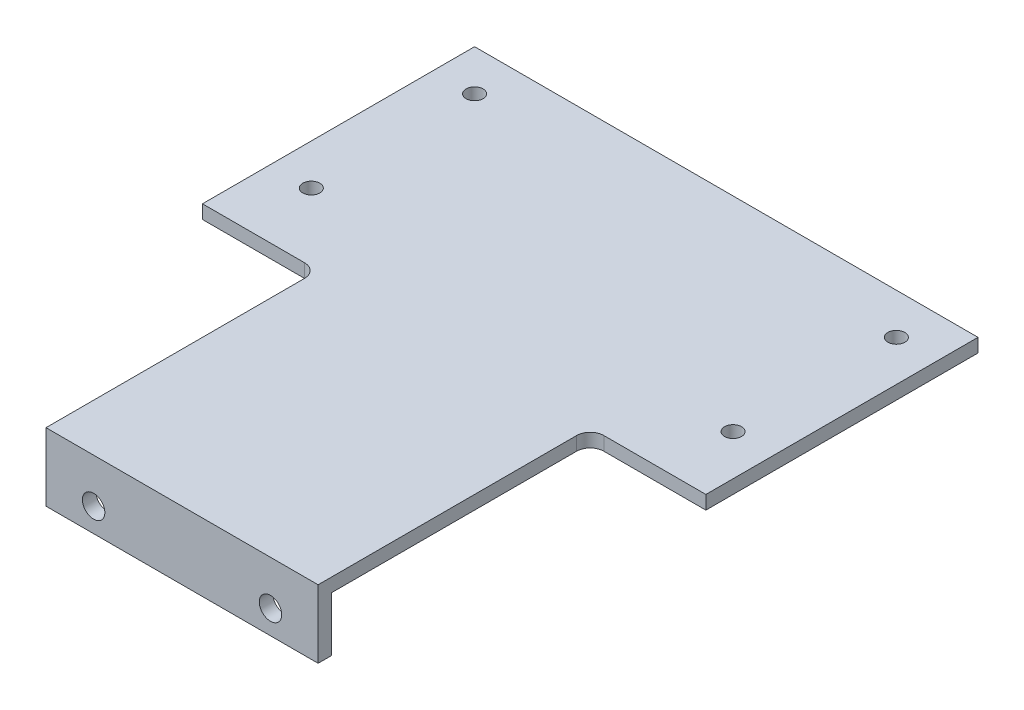
ISO-10303-21;
HEADER;
FILE_DESCRIPTION(('STEP AP214'),'2;1');
FILE_NAME('part.step','',(''),(''),'','','');
FILE_SCHEMA(('AUTOMOTIVE_DESIGN { 1 0 10303 214 1 1 1 1 }'));
ENDSEC;
DATA;
#1=APPLICATION_CONTEXT('core data for automotive mechanical design processes');
#2=APPLICATION_PROTOCOL_DEFINITION('international standard','automotive_design',2000,#1);
#3=PRODUCT_CONTEXT('',#1,'mechanical');
#4=PRODUCT('Part','Part','',(#3));
#5=PRODUCT_RELATED_PRODUCT_CATEGORY('part','',(#4));
#6=PRODUCT_DEFINITION_FORMATION('','',#4);
#7=PRODUCT_DEFINITION_CONTEXT('part definition',#1,'design');
#8=PRODUCT_DEFINITION('design','',#6,#7);
#9=PRODUCT_DEFINITION_SHAPE('','',#8);
#10=(LENGTH_UNIT() NAMED_UNIT(*) SI_UNIT(.MILLI.,.METRE.));
#11=(NAMED_UNIT(*) PLANE_ANGLE_UNIT() SI_UNIT($,.RADIAN.));
#12=(NAMED_UNIT(*) SI_UNIT($,.STERADIAN.) SOLID_ANGLE_UNIT());
#13=UNCERTAINTY_MEASURE_WITH_UNIT(LENGTH_MEASURE(1.E-05),#10,'distance_accuracy_value','');
#14=(GEOMETRIC_REPRESENTATION_CONTEXT(3) GLOBAL_UNCERTAINTY_ASSIGNED_CONTEXT((#13)) GLOBAL_UNIT_ASSIGNED_CONTEXT((#10,
#11,#12)) REPRESENTATION_CONTEXT('',''));
#15=CARTESIAN_POINT('',(0.,0.,0.));
#16=DIRECTION('',(0.,0.,1.));
#17=DIRECTION('',(1.,0.,0.));
#18=AXIS2_PLACEMENT_3D('',#15,#16,#17);
#19=CARTESIAN_POINT('',(0.,0.,0.));
#20=DIRECTION('',(0.,1.,0.));
#21=DIRECTION('',(0.,0.,1.));
#22=AXIS2_PLACEMENT_3D('',#19,#20,#21);
#23=PLANE('',#22);
#24=CARTESIAN_POINT('',(51.,0.,-74.));
#25=DIRECTION('',(0.,1.,0.));
#26=DIRECTION('',(0.,0.,1.));
#27=AXIS2_PLACEMENT_3D('',#24,#25,#26);
#28=CIRCLE('',#27,1.25);
#29=CARTESIAN_POINT('',(51.,0.,-72.75));
#30=VERTEX_POINT('',#29);
#31=EDGE_CURVE('E270',#30,#30,#28,.T.);
#32=ORIENTED_EDGE('',*,*,#31,.T.);
#33=EDGE_LOOP('',(#32));
#34=FACE_BOUND('',#33,.T.);
#35=CARTESIAN_POINT('',(51.,0.,-50.));
#36=DIRECTION('',(0.,1.,0.));
#37=DIRECTION('',(0.,0.,1.));
#38=AXIS2_PLACEMENT_3D('',#35,#36,#37);
#39=CIRCLE('',#38,1.25);
#40=CARTESIAN_POINT('',(51.,0.,-48.75));
#41=VERTEX_POINT('',#40);
#42=EDGE_CURVE('E280',#41,#41,#39,.T.);
#43=ORIENTED_EDGE('',*,*,#42,.T.);
#44=EDGE_LOOP('',(#43));
#45=FACE_BOUND('',#44,.T.);
#46=CARTESIAN_POINT('',(-11.,0.,-50.));
#47=DIRECTION('',(0.,1.,0.));
#48=DIRECTION('',(0.,0.,1.));
#49=AXIS2_PLACEMENT_3D('',#46,#47,#48);
#50=CIRCLE('',#49,1.25);
#51=CARTESIAN_POINT('',(-11.,0.,-48.75));
#52=VERTEX_POINT('',#51);
#53=EDGE_CURVE('E284',#52,#52,#50,.T.);
#54=ORIENTED_EDGE('',*,*,#53,.T.);
#55=EDGE_LOOP('',(#54));
#56=FACE_BOUND('',#55,.T.);
#57=CARTESIAN_POINT('',(-11.,0.,-74.));
#58=DIRECTION('',(0.,1.,0.));
#59=DIRECTION('',(0.,0.,1.));
#60=AXIS2_PLACEMENT_3D('',#57,#58,#59);
#61=CIRCLE('',#60,1.25);
#62=CARTESIAN_POINT('',(-11.,0.,-72.75));
#63=VERTEX_POINT('',#62);
#64=EDGE_CURVE('E288',#63,#63,#61,.T.);
#65=ORIENTED_EDGE('',*,*,#64,.T.);
#66=EDGE_LOOP('',(#65));
#67=FACE_BOUND('',#66,.T.);
#68=DIRECTION('',(1.,0.,0.));
#69=VECTOR('',#68,1.);
#70=CARTESIAN_POINT('',(0.,0.,-2.));
#71=LINE('',#70,#69);
#72=CARTESIAN_POINT('',(0.,0.,-1.99999999999999));
#73=VERTEX_POINT('',#72);
#74=CARTESIAN_POINT('',(40.,0.,-2.));
#75=VERTEX_POINT('',#74);
#76=EDGE_CURVE('E150',#73,#75,#71,.T.);
#77=ORIENTED_EDGE('',*,*,#76,.F.);
#78=DIRECTION('',(0.,0.,1.));
#79=VECTOR('',#78,1.);
#80=CARTESIAN_POINT('',(0.,0.,-40.));
#81=LINE('',#80,#79);
#82=CARTESIAN_POINT('',(0.,0.,-38.));
#83=VERTEX_POINT('',#82);
#84=EDGE_CURVE('E156',#83,#73,#81,.T.);
#85=ORIENTED_EDGE('',*,*,#84,.F.);
#86=CARTESIAN_POINT('',(-2.,0.,-38.));
#87=DIRECTION('',(0.,1.,0.));
#88=DIRECTION('',(0.,0.,1.));
#89=AXIS2_PLACEMENT_3D('',#86,#87,#88);
#90=CIRCLE('',#89,2.);
#91=CARTESIAN_POINT('',(-2.,0.,-40.));
#92=VERTEX_POINT('',#91);
#93=EDGE_CURVE('E217',#83,#92,#90,.T.);
#94=ORIENTED_EDGE('',*,*,#93,.T.);
#95=DIRECTION('',(1.,0.,0.));
#96=VECTOR('',#95,1.);
#97=CARTESIAN_POINT('',(-17.,0.,-40.));
#98=LINE('',#97,#96);
#99=CARTESIAN_POINT('',(-17.,0.,-40.));
#100=VERTEX_POINT('',#99);
#101=EDGE_CURVE('E167',#100,#92,#98,.T.);
#102=ORIENTED_EDGE('',*,*,#101,.F.);
#103=DIRECTION('',(0.,0.,1.));
#104=VECTOR('',#103,1.);
#105=CARTESIAN_POINT('',(-17.,0.,-80.));
#106=LINE('',#105,#104);
#107=CARTESIAN_POINT('',(-17.,0.,-80.));
#108=VERTEX_POINT('',#107);
#109=EDGE_CURVE('E190',#108,#100,#106,.T.);
#110=ORIENTED_EDGE('',*,*,#109,.F.);
#111=DIRECTION('',(-1.,0.,0.));
#112=VECTOR('',#111,1.);
#113=CARTESIAN_POINT('',(-17.,0.,-80.));
#114=LINE('',#113,#112);
#115=CARTESIAN_POINT('',(57.,0.,-80.));
#116=VERTEX_POINT('',#115);
#117=EDGE_CURVE('E188',#116,#108,#114,.T.);
#118=ORIENTED_EDGE('',*,*,#117,.F.);
#119=DIRECTION('',(0.,0.,-1.));
#120=VECTOR('',#119,1.);
#121=CARTESIAN_POINT('',(57.,0.,-80.));
#122=LINE('',#121,#120);
#123=CARTESIAN_POINT('',(57.,0.,-40.));
#124=VERTEX_POINT('',#123);
#125=EDGE_CURVE('E186',#124,#116,#122,.T.);
#126=ORIENTED_EDGE('',*,*,#125,.F.);
#127=DIRECTION('',(1.,0.,0.));
#128=VECTOR('',#127,1.);
#129=CARTESIAN_POINT('',(57.,0.,-40.));
#130=LINE('',#129,#128);
#131=CARTESIAN_POINT('',(42.,0.,-40.));
#132=VERTEX_POINT('',#131);
#133=EDGE_CURVE('E184',#132,#124,#130,.T.);
#134=ORIENTED_EDGE('',*,*,#133,.F.);
#135=CARTESIAN_POINT('',(42.,0.,-38.));
#136=DIRECTION('',(0.,1.,0.));
#137=DIRECTION('',(0.,0.,1.));
#138=AXIS2_PLACEMENT_3D('',#135,#136,#137);
#139=CIRCLE('',#138,2.);
#140=CARTESIAN_POINT('',(40.,0.,-38.));
#141=VERTEX_POINT('',#140);
#142=EDGE_CURVE('E49',#132,#141,#139,.T.);
#143=ORIENTED_EDGE('',*,*,#142,.T.);
#144=DIRECTION('',(0.,0.,-1.));
#145=VECTOR('',#144,1.);
#146=CARTESIAN_POINT('',(40.,0.,-40.));
#147=LINE('',#146,#145);
#148=EDGE_CURVE('E159',#75,#141,#147,.T.);
#149=ORIENTED_EDGE('',*,*,#148,.F.);
#150=EDGE_LOOP('',(#77,#85,#94,#102,#110,#118,#126,#134,#143,#149));
#151=FACE_BOUND('',#150,.T.);
#152=ADVANCED_FACE('F41',(#34,#45,#56,#67,#151),#23,.F.);
#153=CARTESIAN_POINT('',(0.,2.,-40.));
#154=DIRECTION('',(1.,0.,0.));
#155=DIRECTION('',(0.,0.,-1.));
#156=AXIS2_PLACEMENT_3D('',#153,#154,#155);
#157=PLANE('',#156);
#158=DIRECTION('',(0.,0.,1.));
#159=VECTOR('',#158,1.);
#160=CARTESIAN_POINT('',(0.,2.,-40.));
#161=LINE('',#160,#159);
#162=CARTESIAN_POINT('',(0.,2.,-38.));
#163=VERTEX_POINT('',#162);
#164=CARTESIAN_POINT('',(0.,2.,0.));
#165=VERTEX_POINT('',#164);
#166=EDGE_CURVE('E164',#163,#165,#161,.T.);
#167=ORIENTED_EDGE('',*,*,#166,.F.);
#168=DIRECTION('',(0.,-1.,0.));
#169=VECTOR('',#168,1.);
#170=CARTESIAN_POINT('',(0.,0.,-38.));
#171=LINE('',#170,#169);
#172=EDGE_CURVE('E209',#163,#83,#171,.T.);
#173=ORIENTED_EDGE('',*,*,#172,.T.);
#174=ORIENTED_EDGE('',*,*,#84,.T.);
#175=DIRECTION('',(0.,1.,0.));
#176=VECTOR('',#175,1.);
#177=CARTESIAN_POINT('',(0.,-8.,-2.));
#178=LINE('',#177,#176);
#179=CARTESIAN_POINT('',(0.,-8.,-2.));
#180=VERTEX_POINT('',#179);
#181=EDGE_CURVE('E134',#180,#73,#178,.T.);
#182=ORIENTED_EDGE('',*,*,#181,.F.);
#183=DIRECTION('',(0.,0.,-1.));
#184=VECTOR('',#183,1.);
#185=CARTESIAN_POINT('',(0.,-8.,0.));
#186=LINE('',#185,#184);
#187=CARTESIAN_POINT('',(0.,-8.,0.));
#188=VERTEX_POINT('',#187);
#189=EDGE_CURVE('E141',#188,#180,#186,.T.);
#190=ORIENTED_EDGE('',*,*,#189,.F.);
#191=DIRECTION('',(0.,-1.,0.));
#192=VECTOR('',#191,1.);
#193=CARTESIAN_POINT('',(0.,2.,0.));
#194=LINE('',#193,#192);
#195=EDGE_CURVE('E207',#165,#188,#194,.T.);
#196=ORIENTED_EDGE('',*,*,#195,.F.);
#197=EDGE_LOOP('',(#167,#173,#174,#182,#190,#196));
#198=FACE_BOUND('',#197,.T.);
#199=ADVANCED_FACE('F153',(#198),#157,.F.);
#200=CARTESIAN_POINT('',(0.,2.,0.));
#201=DIRECTION('',(0.,0.,-1.));
#202=DIRECTION('',(-1.,0.,0.));
#203=AXIS2_PLACEMENT_3D('',#200,#201,#202);
#204=PLANE('',#203);
#205=CARTESIAN_POINT('',(33.,-4.4999999999999,0.));
#206=DIRECTION('',(0.,0.,-1.));
#207=DIRECTION('',(-1.,0.,0.));
#208=AXIS2_PLACEMENT_3D('',#205,#206,#207);
#209=CIRCLE('',#208,1.64999999999986);
#210=CARTESIAN_POINT('',(31.3500000000001,-4.4999999999999,0.));
#211=VERTEX_POINT('',#210);
#212=EDGE_CURVE('E260',#211,#211,#209,.T.);
#213=ORIENTED_EDGE('',*,*,#212,.T.);
#214=EDGE_LOOP('',(#213));
#215=FACE_BOUND('',#214,.T.);
#216=CARTESIAN_POINT('',(6.99999999999996,-4.4999999999999,0.));
#217=DIRECTION('',(0.,0.,-1.));
#218=DIRECTION('',(-1.,0.,0.));
#219=AXIS2_PLACEMENT_3D('',#216,#217,#218);
#220=CIRCLE('',#219,1.64999999999987);
#221=CARTESIAN_POINT('',(5.35000000000008,-4.4999999999999,0.));
#222=VERTEX_POINT('',#221);
#223=EDGE_CURVE('E275',#222,#222,#220,.T.);
#224=ORIENTED_EDGE('',*,*,#223,.T.);
#225=EDGE_LOOP('',(#224));
#226=FACE_BOUND('',#225,.T.);
#227=ORIENTED_EDGE('',*,*,#195,.T.);
#228=DIRECTION('',(-1.,0.,0.));
#229=VECTOR('',#228,1.);
#230=CARTESIAN_POINT('',(0.,-8.,0.));
#231=LINE('',#230,#229);
#232=CARTESIAN_POINT('',(40.,-8.,0.));
#233=VERTEX_POINT('',#232);
#234=EDGE_CURVE('E147',#233,#188,#231,.T.);
#235=ORIENTED_EDGE('',*,*,#234,.F.);
#236=DIRECTION('',(0.,-1.,0.));
#237=VECTOR('',#236,1.);
#238=CARTESIAN_POINT('',(40.,2.,0.));
#239=LINE('',#238,#237);
#240=CARTESIAN_POINT('',(40.,2.,0.));
#241=VERTEX_POINT('',#240);
#242=EDGE_CURVE('E205',#241,#233,#239,.T.);
#243=ORIENTED_EDGE('',*,*,#242,.F.);
#244=DIRECTION('',(1.,0.,0.));
#245=VECTOR('',#244,1.);
#246=CARTESIAN_POINT('',(0.,2.,0.));
#247=LINE('',#246,#245);
#248=EDGE_CURVE('E166',#165,#241,#247,.T.);
#249=ORIENTED_EDGE('',*,*,#248,.F.);
#250=EDGE_LOOP('',(#227,#235,#243,#249));
#251=FACE_BOUND('',#250,.T.);
#252=ADVANCED_FACE('F258',(#215,#226,#251),#204,.F.);
#253=CARTESIAN_POINT('',(40.,2.,-40.));
#254=DIRECTION('',(-1.,0.,0.));
#255=DIRECTION('',(0.,0.,1.));
#256=AXIS2_PLACEMENT_3D('',#253,#254,#255);
#257=PLANE('',#256);
#258=ORIENTED_EDGE('',*,*,#148,.T.);
#259=DIRECTION('',(0.,-1.,0.));
#260=VECTOR('',#259,1.);
#261=CARTESIAN_POINT('',(40.,2.,-38.));
#262=LINE('',#261,#260);
#263=CARTESIAN_POINT('',(40.,2.,-38.));
#264=VERTEX_POINT('',#263);
#265=EDGE_CURVE('E56',#141,#264,#262,.F.);
#266=ORIENTED_EDGE('',*,*,#265,.T.);
#267=DIRECTION('',(0.,0.,-1.));
#268=VECTOR('',#267,1.);
#269=CARTESIAN_POINT('',(40.,2.,-40.));
#270=LINE('',#269,#268);
#271=EDGE_CURVE('E169',#241,#264,#270,.T.);
#272=ORIENTED_EDGE('',*,*,#271,.F.);
#273=ORIENTED_EDGE('',*,*,#242,.T.);
#274=DIRECTION('',(0.,0.,1.));
#275=VECTOR('',#274,1.);
#276=CARTESIAN_POINT('',(40.,-8.,0.));
#277=LINE('',#276,#275);
#278=CARTESIAN_POINT('',(40.,-8.,-2.));
#279=VERTEX_POINT('',#278);
#280=EDGE_CURVE('E140',#279,#233,#277,.T.);
#281=ORIENTED_EDGE('',*,*,#280,.F.);
#282=DIRECTION('',(0.,1.,0.));
#283=VECTOR('',#282,1.);
#284=CARTESIAN_POINT('',(40.,-8.,-2.));
#285=LINE('',#284,#283);
#286=EDGE_CURVE('E136',#279,#75,#285,.T.);
#287=ORIENTED_EDGE('',*,*,#286,.T.);
#288=EDGE_LOOP('',(#258,#266,#272,#273,#281,#287));
#289=FACE_BOUND('',#288,.T.);
#290=ADVANCED_FACE('F255',(#289),#257,.F.);
#291=CARTESIAN_POINT('',(57.,2.,-40.));
#292=DIRECTION('',(0.,0.,-1.));
#293=DIRECTION('',(-1.,0.,0.));
#294=AXIS2_PLACEMENT_3D('',#291,#292,#293);
#295=PLANE('',#294);
#296=DIRECTION('',(1.,0.,0.));
#297=VECTOR('',#296,1.);
#298=CARTESIAN_POINT('',(57.,2.,-40.));
#299=LINE('',#298,#297);
#300=CARTESIAN_POINT('',(42.,2.,-40.));
#301=VERTEX_POINT('',#300);
#302=CARTESIAN_POINT('',(57.,2.,-40.));
#303=VERTEX_POINT('',#302);
#304=EDGE_CURVE('E171',#301,#303,#299,.T.);
#305=ORIENTED_EDGE('',*,*,#304,.F.);
#306=DIRECTION('',(0.,-1.,0.));
#307=VECTOR('',#306,1.);
#308=CARTESIAN_POINT('',(42.,0.,-40.));
#309=LINE('',#308,#307);
#310=EDGE_CURVE('E213',#301,#132,#309,.T.);
#311=ORIENTED_EDGE('',*,*,#310,.T.);
#312=ORIENTED_EDGE('',*,*,#133,.T.);
#313=DIRECTION('',(0.,-1.,0.));
#314=VECTOR('',#313,1.);
#315=CARTESIAN_POINT('',(57.,2.,-40.));
#316=LINE('',#315,#314);
#317=EDGE_CURVE('E202',#303,#124,#316,.T.);
#318=ORIENTED_EDGE('',*,*,#317,.F.);
#319=EDGE_LOOP('',(#305,#311,#312,#318));
#320=FACE_BOUND('',#319,.T.);
#321=ADVANCED_FACE('F250',(#320),#295,.F.);
#322=CARTESIAN_POINT('',(57.,2.,-80.));
#323=DIRECTION('',(-1.,0.,0.));
#324=DIRECTION('',(0.,0.,1.));
#325=AXIS2_PLACEMENT_3D('',#322,#323,#324);
#326=PLANE('',#325);
#327=ORIENTED_EDGE('',*,*,#125,.T.);
#328=DIRECTION('',(0.,-1.,0.));
#329=VECTOR('',#328,1.);
#330=CARTESIAN_POINT('',(57.,2.,-80.));
#331=LINE('',#330,#329);
#332=CARTESIAN_POINT('',(57.,2.,-80.));
#333=VERTEX_POINT('',#332);
#334=EDGE_CURVE('E199',#333,#116,#331,.T.);
#335=ORIENTED_EDGE('',*,*,#334,.F.);
#336=DIRECTION('',(0.,0.,-1.));
#337=VECTOR('',#336,1.);
#338=CARTESIAN_POINT('',(57.,2.,-80.));
#339=LINE('',#338,#337);
#340=EDGE_CURVE('E173',#303,#333,#339,.T.);
#341=ORIENTED_EDGE('',*,*,#340,.F.);
#342=ORIENTED_EDGE('',*,*,#317,.T.);
#343=EDGE_LOOP('',(#327,#335,#341,#342));
#344=FACE_BOUND('',#343,.T.);
#345=ADVANCED_FACE('F246',(#344),#326,.F.);
#346=CARTESIAN_POINT('',(-17.,2.,-80.));
#347=DIRECTION('',(0.,0.,1.));
#348=DIRECTION('',(1.,0.,0.));
#349=AXIS2_PLACEMENT_3D('',#346,#347,#348);
#350=PLANE('',#349);
#351=ORIENTED_EDGE('',*,*,#117,.T.);
#352=DIRECTION('',(0.,-1.,0.));
#353=VECTOR('',#352,1.);
#354=CARTESIAN_POINT('',(-17.,2.,-80.));
#355=LINE('',#354,#353);
#356=CARTESIAN_POINT('',(-17.,2.,-80.));
#357=VERTEX_POINT('',#356);
#358=EDGE_CURVE('E196',#357,#108,#355,.T.);
#359=ORIENTED_EDGE('',*,*,#358,.F.);
#360=DIRECTION('',(-1.,0.,0.));
#361=VECTOR('',#360,1.);
#362=CARTESIAN_POINT('',(-17.,2.,-80.));
#363=LINE('',#362,#361);
#364=EDGE_CURVE('E175',#333,#357,#363,.T.);
#365=ORIENTED_EDGE('',*,*,#364,.F.);
#366=ORIENTED_EDGE('',*,*,#334,.T.);
#367=EDGE_LOOP('',(#351,#359,#365,#366));
#368=FACE_BOUND('',#367,.T.);
#369=ADVANCED_FACE('F241',(#368),#350,.F.);
#370=CARTESIAN_POINT('',(-17.,2.,-80.));
#371=DIRECTION('',(1.,0.,0.));
#372=DIRECTION('',(0.,0.,-1.));
#373=AXIS2_PLACEMENT_3D('',#370,#371,#372);
#374=PLANE('',#373);
#375=ORIENTED_EDGE('',*,*,#109,.T.);
#376=DIRECTION('',(0.,-1.,0.));
#377=VECTOR('',#376,1.);
#378=CARTESIAN_POINT('',(-17.,2.,-40.));
#379=LINE('',#378,#377);
#380=CARTESIAN_POINT('',(-17.,2.,-40.));
#381=VERTEX_POINT('',#380);
#382=EDGE_CURVE('E181',#381,#100,#379,.T.);
#383=ORIENTED_EDGE('',*,*,#382,.F.);
#384=DIRECTION('',(0.,0.,1.));
#385=VECTOR('',#384,1.);
#386=CARTESIAN_POINT('',(-17.,2.,-80.));
#387=LINE('',#386,#385);
#388=EDGE_CURVE('E177',#357,#381,#387,.T.);
#389=ORIENTED_EDGE('',*,*,#388,.F.);
#390=ORIENTED_EDGE('',*,*,#358,.T.);
#391=EDGE_LOOP('',(#375,#383,#389,#390));
#392=FACE_BOUND('',#391,.T.);
#393=ADVANCED_FACE('F236',(#392),#374,.F.);
#394=CARTESIAN_POINT('',(-17.,2.,-40.));
#395=DIRECTION('',(0.,0.,-1.));
#396=DIRECTION('',(-1.,0.,0.));
#397=AXIS2_PLACEMENT_3D('',#394,#395,#396);
#398=PLANE('',#397);
#399=ORIENTED_EDGE('',*,*,#101,.T.);
#400=DIRECTION('',(0.,-1.,0.));
#401=VECTOR('',#400,1.);
#402=CARTESIAN_POINT('',(-2.,2.,-40.));
#403=LINE('',#402,#401);
#404=CARTESIAN_POINT('',(-2.,2.,-40.));
#405=VERTEX_POINT('',#404);
#406=EDGE_CURVE('E211',#92,#405,#403,.F.);
#407=ORIENTED_EDGE('',*,*,#406,.T.);
#408=DIRECTION('',(1.,0.,0.));
#409=VECTOR('',#408,1.);
#410=CARTESIAN_POINT('',(-17.,2.,-40.));
#411=LINE('',#410,#409);
#412=EDGE_CURVE('E179',#381,#405,#411,.T.);
#413=ORIENTED_EDGE('',*,*,#412,.F.);
#414=ORIENTED_EDGE('',*,*,#382,.T.);
#415=EDGE_LOOP('',(#399,#407,#413,#414));
#416=FACE_BOUND('',#415,.T.);
#417=ADVANCED_FACE('F232',(#416),#398,.F.);
#418=CARTESIAN_POINT('',(0.,2.,0.));
#419=DIRECTION('',(0.,1.,0.));
#420=DIRECTION('',(0.,0.,1.));
#421=AXIS2_PLACEMENT_3D('',#418,#419,#420);
#422=PLANE('',#421);
#423=CARTESIAN_POINT('',(51.,2.,-74.));
#424=DIRECTION('',(0.,1.,0.));
#425=DIRECTION('',(0.,0.,-1.));
#426=AXIS2_PLACEMENT_3D('',#423,#424,#425);
#427=CIRCLE('',#426,1.25);
#428=CARTESIAN_POINT('',(51.,2.,-75.25));
#429=VERTEX_POINT('',#428);
#430=EDGE_CURVE('E297',#429,#429,#427,.T.);
#431=ORIENTED_EDGE('',*,*,#430,.F.);
#432=EDGE_LOOP('',(#431));
#433=FACE_BOUND('',#432,.T.);
#434=CARTESIAN_POINT('',(51.,2.,-50.));
#435=DIRECTION('',(0.,1.,0.));
#436=DIRECTION('',(0.,0.,-1.));
#437=AXIS2_PLACEMENT_3D('',#434,#435,#436);
#438=CIRCLE('',#437,1.25);
#439=CARTESIAN_POINT('',(51.,2.,-51.25));
#440=VERTEX_POINT('',#439);
#441=EDGE_CURVE('E300',#440,#440,#438,.T.);
#442=ORIENTED_EDGE('',*,*,#441,.F.);
#443=EDGE_LOOP('',(#442));
#444=FACE_BOUND('',#443,.T.);
#445=CARTESIAN_POINT('',(-11.,2.,-50.));
#446=DIRECTION('',(0.,1.,0.));
#447=DIRECTION('',(0.,0.,1.));
#448=AXIS2_PLACEMENT_3D('',#445,#446,#447);
#449=CIRCLE('',#448,1.25);
#450=CARTESIAN_POINT('',(-11.,2.,-48.75));
#451=VERTEX_POINT('',#450);
#452=EDGE_CURVE('E296',#451,#451,#449,.T.);
#453=ORIENTED_EDGE('',*,*,#452,.F.);
#454=EDGE_LOOP('',(#453));
#455=FACE_BOUND('',#454,.T.);
#456=CARTESIAN_POINT('',(-11.,2.,-74.));
#457=DIRECTION('',(0.,1.,0.));
#458=DIRECTION('',(0.,0.,1.));
#459=AXIS2_PLACEMENT_3D('',#456,#457,#458);
#460=CIRCLE('',#459,1.25);
#461=CARTESIAN_POINT('',(-11.,2.,-72.75));
#462=VERTEX_POINT('',#461);
#463=EDGE_CURVE('E293',#462,#462,#460,.T.);
#464=ORIENTED_EDGE('',*,*,#463,.F.);
#465=EDGE_LOOP('',(#464));
#466=FACE_BOUND('',#465,.T.);
#467=ORIENTED_EDGE('',*,*,#412,.T.);
#468=CARTESIAN_POINT('',(-2.,2.,-38.));
#469=DIRECTION('',(0.,1.,0.));
#470=DIRECTION('',(0.,0.,1.));
#471=AXIS2_PLACEMENT_3D('',#468,#469,#470);
#472=CIRCLE('',#471,2.);
#473=EDGE_CURVE('E219',#405,#163,#472,.F.);
#474=ORIENTED_EDGE('',*,*,#473,.T.);
#475=ORIENTED_EDGE('',*,*,#166,.T.);
#476=ORIENTED_EDGE('',*,*,#248,.T.);
#477=ORIENTED_EDGE('',*,*,#271,.T.);
#478=CARTESIAN_POINT('',(42.,2.,-38.));
#479=DIRECTION('',(0.,1.,0.));
#480=DIRECTION('',(0.,0.,1.));
#481=AXIS2_PLACEMENT_3D('',#478,#479,#480);
#482=CIRCLE('',#481,2.);
#483=EDGE_CURVE('E11',#264,#301,#482,.F.);
#484=ORIENTED_EDGE('',*,*,#483,.T.);
#485=ORIENTED_EDGE('',*,*,#304,.T.);
#486=ORIENTED_EDGE('',*,*,#340,.T.);
#487=ORIENTED_EDGE('',*,*,#364,.T.);
#488=ORIENTED_EDGE('',*,*,#388,.T.);
#489=EDGE_LOOP('',(#467,#474,#475,#476,#477,#484,#485,#486,#487,#488));
#490=FACE_BOUND('',#489,.T.);
#491=ADVANCED_FACE('F222',(#433,#444,#455,#466,#490),#422,.T.);
#492=CARTESIAN_POINT('',(0.,-8.,-2.));
#493=DIRECTION('',(0.,0.,1.));
#494=DIRECTION('',(1.,0.,0.));
#495=AXIS2_PLACEMENT_3D('',#492,#493,#494);
#496=PLANE('',#495);
#497=CARTESIAN_POINT('',(33.,-4.4999999999999,-2.));
#498=DIRECTION('',(0.,0.,-1.));
#499=DIRECTION('',(-1.,0.,0.));
#500=AXIS2_PLACEMENT_3D('',#497,#498,#499);
#501=CIRCLE('',#500,1.64999999999986);
#502=CARTESIAN_POINT('',(31.3500000000001,-4.4999999999999,-2.));
#503=VERTEX_POINT('',#502);
#504=EDGE_CURVE('E262',#503,#503,#501,.T.);
#505=ORIENTED_EDGE('',*,*,#504,.F.);
#506=EDGE_LOOP('',(#505));
#507=FACE_BOUND('',#506,.T.);
#508=CARTESIAN_POINT('',(6.99999999999996,-4.4999999999999,-2.));
#509=DIRECTION('',(0.,0.,-1.));
#510=DIRECTION('',(-1.,0.,0.));
#511=AXIS2_PLACEMENT_3D('',#508,#509,#510);
#512=CIRCLE('',#511,1.64999999999987);
#513=CARTESIAN_POINT('',(5.35000000000008,-4.4999999999999,-2.));
#514=VERTEX_POINT('',#513);
#515=EDGE_CURVE('E267',#514,#514,#512,.T.);
#516=ORIENTED_EDGE('',*,*,#515,.F.);
#517=EDGE_LOOP('',(#516));
#518=FACE_BOUND('',#517,.T.);
#519=ORIENTED_EDGE('',*,*,#76,.T.);
#520=ORIENTED_EDGE('',*,*,#286,.F.);
#521=DIRECTION('',(1.,0.,0.));
#522=VECTOR('',#521,1.);
#523=CARTESIAN_POINT('',(0.,-8.,-2.));
#524=LINE('',#523,#522);
#525=EDGE_CURVE('E129',#180,#279,#524,.T.);
#526=ORIENTED_EDGE('',*,*,#525,.F.);
#527=ORIENTED_EDGE('',*,*,#181,.T.);
#528=EDGE_LOOP('',(#519,#520,#526,#527));
#529=FACE_BOUND('',#528,.T.);
#530=ADVANCED_FACE('F132',(#507,#518,#529),#496,.F.);
#531=CARTESIAN_POINT('',(0.,-8.,0.));
#532=DIRECTION('',(0.,-1.,0.));
#533=DIRECTION('',(0.,0.,-1.));
#534=AXIS2_PLACEMENT_3D('',#531,#532,#533);
#535=PLANE('',#534);
#536=ORIENTED_EDGE('',*,*,#189,.T.);
#537=ORIENTED_EDGE('',*,*,#525,.T.);
#538=ORIENTED_EDGE('',*,*,#280,.T.);
#539=ORIENTED_EDGE('',*,*,#234,.T.);
#540=EDGE_LOOP('',(#536,#537,#538,#539));
#541=FACE_BOUND('',#540,.T.);
#542=ADVANCED_FACE('F145',(#541),#535,.T.);
#543=CARTESIAN_POINT('',(6.99999999999996,-4.4999999999999,0.));
#544=DIRECTION('',(0.,0.,-1.));
#545=DIRECTION('',(-1.,0.,0.));
#546=AXIS2_PLACEMENT_3D('',#543,#544,#545);
#547=CYLINDRICAL_SURFACE('',#546,1.64999999999987);
#548=ORIENTED_EDGE('',*,*,#223,.F.);
#549=EDGE_LOOP('',(#548));
#550=FACE_BOUND('',#549,.T.);
#551=ORIENTED_EDGE('',*,*,#515,.T.);
#552=EDGE_LOOP('',(#551));
#553=FACE_BOUND('',#552,.T.);
#554=ADVANCED_FACE('F362',(#550,#553),#547,.F.);
#555=CARTESIAN_POINT('',(33.,-4.4999999999999,0.));
#556=DIRECTION('',(0.,0.,-1.));
#557=DIRECTION('',(-1.,0.,0.));
#558=AXIS2_PLACEMENT_3D('',#555,#556,#557);
#559=CYLINDRICAL_SURFACE('',#558,1.64999999999986);
#560=ORIENTED_EDGE('',*,*,#212,.F.);
#561=EDGE_LOOP('',(#560));
#562=FACE_BOUND('',#561,.T.);
#563=ORIENTED_EDGE('',*,*,#504,.T.);
#564=EDGE_LOOP('',(#563));
#565=FACE_BOUND('',#564,.T.);
#566=ADVANCED_FACE('F318',(#562,#565),#559,.F.);
#567=CARTESIAN_POINT('',(-11.,-8.,-74.));
#568=DIRECTION('',(0.,1.,0.));
#569=DIRECTION('',(0.,0.,1.));
#570=AXIS2_PLACEMENT_3D('',#567,#568,#569);
#571=CYLINDRICAL_SURFACE('',#570,1.25);
#572=ORIENTED_EDGE('',*,*,#463,.T.);
#573=EDGE_LOOP('',(#572));
#574=FACE_BOUND('',#573,.T.);
#575=ORIENTED_EDGE('',*,*,#64,.F.);
#576=EDGE_LOOP('',(#575));
#577=FACE_BOUND('',#576,.T.);
#578=ADVANCED_FACE('F315',(#574,#577),#571,.F.);
#579=CARTESIAN_POINT('',(-11.,-8.,-50.));
#580=DIRECTION('',(0.,1.,0.));
#581=DIRECTION('',(0.,0.,1.));
#582=AXIS2_PLACEMENT_3D('',#579,#580,#581);
#583=CYLINDRICAL_SURFACE('',#582,1.25);
#584=ORIENTED_EDGE('',*,*,#452,.T.);
#585=EDGE_LOOP('',(#584));
#586=FACE_BOUND('',#585,.T.);
#587=ORIENTED_EDGE('',*,*,#53,.F.);
#588=EDGE_LOOP('',(#587));
#589=FACE_BOUND('',#588,.T.);
#590=ADVANCED_FACE('F306',(#586,#589),#583,.F.);
#591=CARTESIAN_POINT('',(51.,-8.,-50.));
#592=DIRECTION('',(0.,1.,0.));
#593=DIRECTION('',(0.,0.,1.));
#594=AXIS2_PLACEMENT_3D('',#591,#592,#593);
#595=CYLINDRICAL_SURFACE('',#594,1.25);
#596=ORIENTED_EDGE('',*,*,#441,.T.);
#597=EDGE_LOOP('',(#596));
#598=FACE_BOUND('',#597,.T.);
#599=ORIENTED_EDGE('',*,*,#42,.F.);
#600=EDGE_LOOP('',(#599));
#601=FACE_BOUND('',#600,.T.);
#602=ADVANCED_FACE('F349',(#598,#601),#595,.F.);
#603=CARTESIAN_POINT('',(51.,-8.,-74.));
#604=DIRECTION('',(0.,1.,0.));
#605=DIRECTION('',(0.,0.,1.));
#606=AXIS2_PLACEMENT_3D('',#603,#604,#605);
#607=CYLINDRICAL_SURFACE('',#606,1.25);
#608=ORIENTED_EDGE('',*,*,#430,.T.);
#609=EDGE_LOOP('',(#608));
#610=FACE_BOUND('',#609,.T.);
#611=ORIENTED_EDGE('',*,*,#31,.F.);
#612=EDGE_LOOP('',(#611));
#613=FACE_BOUND('',#612,.T.);
#614=ADVANCED_FACE('F345',(#610,#613),#607,.F.);
#615=CARTESIAN_POINT('',(-2.,2.,-38.));
#616=DIRECTION('',(0.,1.,0.));
#617=DIRECTION('',(0.,0.,1.));
#618=AXIS2_PLACEMENT_3D('',#615,#616,#617);
#619=CYLINDRICAL_SURFACE('',#618,2.);
#620=ORIENTED_EDGE('',*,*,#473,.F.);
#621=ORIENTED_EDGE('',*,*,#406,.F.);
#622=ORIENTED_EDGE('',*,*,#93,.F.);
#623=ORIENTED_EDGE('',*,*,#172,.F.);
#624=EDGE_LOOP('',(#620,#621,#622,#623));
#625=FACE_BOUND('',#624,.T.);
#626=ADVANCED_FACE('F228',(#625),#619,.F.);
#627=CARTESIAN_POINT('',(42.,2.,-38.));
#628=DIRECTION('',(0.,1.,0.));
#629=DIRECTION('',(0.,0.,1.));
#630=AXIS2_PLACEMENT_3D('',#627,#628,#629);
#631=CYLINDRICAL_SURFACE('',#630,2.);
#632=ORIENTED_EDGE('',*,*,#483,.F.);
#633=ORIENTED_EDGE('',*,*,#265,.F.);
#634=ORIENTED_EDGE('',*,*,#142,.F.);
#635=ORIENTED_EDGE('',*,*,#310,.F.);
#636=EDGE_LOOP('',(#632,#633,#634,#635));
#637=FACE_BOUND('',#636,.T.);
#638=ADVANCED_FACE('F43',(#637),#631,.F.);
#639=CLOSED_SHELL('',(#152,#199,#252,#290,#321,#345,#369,#393,#417,#491,#530,#542,#554,#566,
#578,#590,#602,#614,#626,#638));
#640=MANIFOLD_SOLID_BREP('B2',#639);
#641=ADVANCED_BREP_SHAPE_REPRESENTATION('',(#18,#640),#14);
#642=SHAPE_DEFINITION_REPRESENTATION(#9,#641);
ENDSEC;
END-ISO-10303-21;
